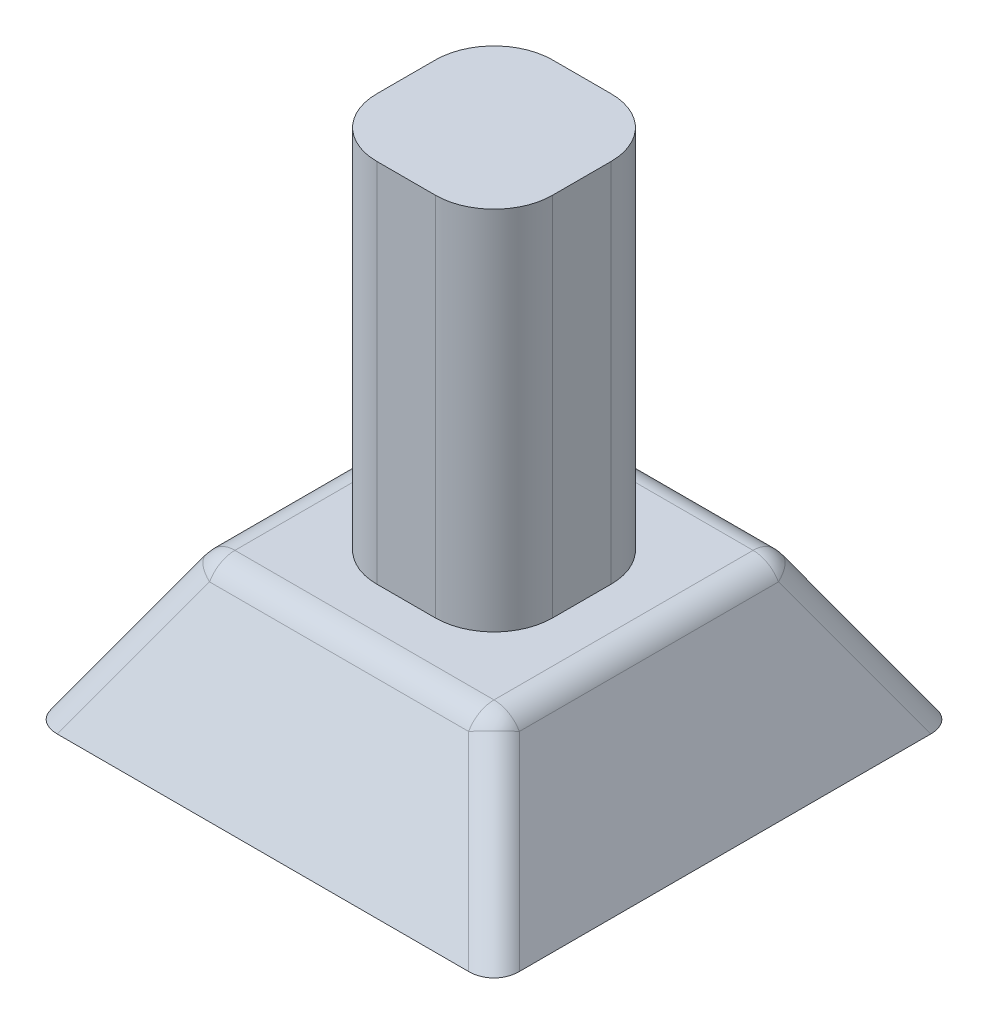
ISO-10303-21;
HEADER;
FILE_DESCRIPTION(('STEP AP214'),'2;1');
FILE_NAME('part.step','',(''),(''),'','','');
FILE_SCHEMA(('AUTOMOTIVE_DESIGN { 1 0 10303 214 1 1 1 1 }'));
ENDSEC;
DATA;
#1=APPLICATION_CONTEXT('core data for automotive mechanical design processes');
#2=APPLICATION_PROTOCOL_DEFINITION('international standard','automotive_design',2000,#1);
#3=PRODUCT_CONTEXT('',#1,'mechanical');
#4=PRODUCT('Part','Part','',(#3));
#5=PRODUCT_RELATED_PRODUCT_CATEGORY('part','',(#4));
#6=PRODUCT_DEFINITION_FORMATION('','',#4);
#7=PRODUCT_DEFINITION_CONTEXT('part definition',#1,'design');
#8=PRODUCT_DEFINITION('design','',#6,#7);
#9=PRODUCT_DEFINITION_SHAPE('','',#8);
#10=(LENGTH_UNIT() NAMED_UNIT(*) SI_UNIT(.MILLI.,.METRE.));
#11=(NAMED_UNIT(*) PLANE_ANGLE_UNIT() SI_UNIT($,.RADIAN.));
#12=(NAMED_UNIT(*) SI_UNIT($,.STERADIAN.) SOLID_ANGLE_UNIT());
#13=UNCERTAINTY_MEASURE_WITH_UNIT(LENGTH_MEASURE(1.E-05),#10,'distance_accuracy_value','');
#14=(GEOMETRIC_REPRESENTATION_CONTEXT(3) GLOBAL_UNCERTAINTY_ASSIGNED_CONTEXT((#13)) GLOBAL_UNIT_ASSIGNED_CONTEXT((#10,
#11,#12)) REPRESENTATION_CONTEXT('',''));
#15=CARTESIAN_POINT('',(0.,0.,0.));
#16=DIRECTION('',(0.,0.,1.));
#17=DIRECTION('',(1.,0.,0.));
#18=AXIS2_PLACEMENT_3D('',#15,#16,#17);
#19=CARTESIAN_POINT('',(-7.62,31.75,7.62));
#20=DIRECTION('',(1.,0.,0.));
#21=DIRECTION('',(0.,0.,-1.));
#22=AXIS2_PLACEMENT_3D('',#19,#20,#21);
#23=PLANE('',#22);
#24=DIRECTION('',(0.,0.,1.));
#25=VECTOR('',#24,1.);
#26=CARTESIAN_POINT('',(-7.62,31.75,7.62));
#27=LINE('',#26,#25);
#28=CARTESIAN_POINT('',(-7.62,31.75,-2.53999999999999));
#29=VERTEX_POINT('',#28);
#30=CARTESIAN_POINT('',(-7.62,31.75,2.54));
#31=VERTEX_POINT('',#30);
#32=EDGE_CURVE('E239',#29,#31,#27,.T.);
#33=ORIENTED_EDGE('',*,*,#32,.F.);
#34=DIRECTION('',(0.,-1.,0.));
#35=VECTOR('',#34,1.);
#36=CARTESIAN_POINT('',(-7.62,31.75,-2.54));
#37=LINE('',#36,#35);
#38=CARTESIAN_POINT('',(-7.62,0.,-2.53999999999999));
#39=VERTEX_POINT('',#38);
#40=EDGE_CURVE('E261',#29,#39,#37,.T.);
#41=ORIENTED_EDGE('',*,*,#40,.T.);
#42=DIRECTION('',(0.,0.,1.));
#43=VECTOR('',#42,1.);
#44=CARTESIAN_POINT('',(-7.62,0.,7.62));
#45=LINE('',#44,#43);
#46=CARTESIAN_POINT('',(-7.62,0.,2.54));
#47=VERTEX_POINT('',#46);
#48=EDGE_CURVE('E238',#39,#47,#45,.T.);
#49=ORIENTED_EDGE('',*,*,#48,.T.);
#50=DIRECTION('',(0.,-1.,0.));
#51=VECTOR('',#50,1.);
#52=CARTESIAN_POINT('',(-7.62,31.75,2.54));
#53=LINE('',#52,#51);
#54=EDGE_CURVE('E252',#47,#31,#53,.F.);
#55=ORIENTED_EDGE('',*,*,#54,.T.);
#56=EDGE_LOOP('',(#33,#41,#49,#55));
#57=FACE_BOUND('',#56,.T.);
#58=ADVANCED_FACE('F33',(#57),#23,.F.);
#59=CARTESIAN_POINT('',(7.62,31.75,7.62));
#60=DIRECTION('',(0.,0.,-1.));
#61=DIRECTION('',(-1.,0.,0.));
#62=AXIS2_PLACEMENT_3D('',#59,#60,#61);
#63=PLANE('',#62);
#64=DIRECTION('',(1.,0.,0.));
#65=VECTOR('',#64,1.);
#66=CARTESIAN_POINT('',(7.62,31.75,7.62));
#67=LINE('',#66,#65);
#68=CARTESIAN_POINT('',(-2.53999999999999,31.75,7.62));
#69=VERTEX_POINT('',#68);
#70=CARTESIAN_POINT('',(2.54,31.75,7.62));
#71=VERTEX_POINT('',#70);
#72=EDGE_CURVE('E242',#69,#71,#67,.T.);
#73=ORIENTED_EDGE('',*,*,#72,.F.);
#74=DIRECTION('',(0.,-1.,0.));
#75=VECTOR('',#74,1.);
#76=CARTESIAN_POINT('',(-2.54,31.75,7.62));
#77=LINE('',#76,#75);
#78=CARTESIAN_POINT('',(-2.53999999999999,0.,7.62));
#79=VERTEX_POINT('',#78);
#80=EDGE_CURVE('E291',#69,#79,#77,.T.);
#81=ORIENTED_EDGE('',*,*,#80,.T.);
#82=DIRECTION('',(1.,0.,0.));
#83=VECTOR('',#82,1.);
#84=CARTESIAN_POINT('',(7.62,0.,7.62));
#85=LINE('',#84,#83);
#86=CARTESIAN_POINT('',(2.54,0.,7.62));
#87=VERTEX_POINT('',#86);
#88=EDGE_CURVE('E255',#79,#87,#85,.T.);
#89=ORIENTED_EDGE('',*,*,#88,.T.);
#90=DIRECTION('',(0.,-1.,0.));
#91=VECTOR('',#90,1.);
#92=CARTESIAN_POINT('',(2.54,31.75,7.62));
#93=LINE('',#92,#91);
#94=EDGE_CURVE('E289',#87,#71,#93,.F.);
#95=ORIENTED_EDGE('',*,*,#94,.T.);
#96=EDGE_LOOP('',(#73,#81,#89,#95));
#97=FACE_BOUND('',#96,.T.);
#98=ADVANCED_FACE('F388',(#97),#63,.F.);
#99=CARTESIAN_POINT('',(7.62,31.75,7.62));
#100=DIRECTION('',(-1.,0.,0.));
#101=DIRECTION('',(0.,0.,1.));
#102=AXIS2_PLACEMENT_3D('',#99,#100,#101);
#103=PLANE('',#102);
#104=DIRECTION('',(0.,0.,-1.));
#105=VECTOR('',#104,1.);
#106=CARTESIAN_POINT('',(7.62,31.75,7.62));
#107=LINE('',#106,#105);
#108=CARTESIAN_POINT('',(7.62,31.75,2.54));
#109=VERTEX_POINT('',#108);
#110=CARTESIAN_POINT('',(7.62,31.75,-2.54));
#111=VERTEX_POINT('',#110);
#112=EDGE_CURVE('E246',#109,#111,#107,.T.);
#113=ORIENTED_EDGE('',*,*,#112,.F.);
#114=DIRECTION('',(0.,-1.,0.));
#115=VECTOR('',#114,1.);
#116=CARTESIAN_POINT('',(7.62,31.75,2.54));
#117=LINE('',#116,#115);
#118=CARTESIAN_POINT('',(7.62,0.,2.54));
#119=VERTEX_POINT('',#118);
#120=EDGE_CURVE('E296',#109,#119,#117,.T.);
#121=ORIENTED_EDGE('',*,*,#120,.T.);
#122=DIRECTION('',(0.,0.,-1.));
#123=VECTOR('',#122,1.);
#124=CARTESIAN_POINT('',(7.62,0.,7.62));
#125=LINE('',#124,#123);
#126=CARTESIAN_POINT('',(7.62,0.,-2.54));
#127=VERTEX_POINT('',#126);
#128=EDGE_CURVE('E257',#119,#127,#125,.T.);
#129=ORIENTED_EDGE('',*,*,#128,.T.);
#130=DIRECTION('',(0.,-1.,0.));
#131=VECTOR('',#130,1.);
#132=CARTESIAN_POINT('',(7.62,31.75,-2.54));
#133=LINE('',#132,#131);
#134=EDGE_CURVE('E294',#127,#111,#133,.F.);
#135=ORIENTED_EDGE('',*,*,#134,.T.);
#136=EDGE_LOOP('',(#113,#121,#129,#135));
#137=FACE_BOUND('',#136,.T.);
#138=ADVANCED_FACE('F394',(#137),#103,.F.);
#139=CARTESIAN_POINT('',(7.62,31.75,-7.62));
#140=DIRECTION('',(0.,0.,1.));
#141=DIRECTION('',(1.,0.,0.));
#142=AXIS2_PLACEMENT_3D('',#139,#140,#141);
#143=PLANE('',#142);
#144=DIRECTION('',(-1.,0.,0.));
#145=VECTOR('',#144,1.);
#146=CARTESIAN_POINT('',(7.62,0.,-7.62));
#147=LINE('',#146,#145);
#148=CARTESIAN_POINT('',(2.54,0.,-7.62));
#149=VERTEX_POINT('',#148);
#150=CARTESIAN_POINT('',(-2.54,0.,-7.62));
#151=VERTEX_POINT('',#150);
#152=EDGE_CURVE('E243',#149,#151,#147,.T.);
#153=ORIENTED_EDGE('',*,*,#152,.T.);
#154=DIRECTION('',(0.,-1.,0.));
#155=VECTOR('',#154,1.);
#156=CARTESIAN_POINT('',(-2.54,31.75,-7.62));
#157=LINE('',#156,#155);
#158=CARTESIAN_POINT('',(-2.54,31.75,-7.62));
#159=VERTEX_POINT('',#158);
#160=EDGE_CURVE('E279',#151,#159,#157,.F.);
#161=ORIENTED_EDGE('',*,*,#160,.T.);
#162=DIRECTION('',(-1.,0.,0.));
#163=VECTOR('',#162,1.);
#164=CARTESIAN_POINT('',(7.62,31.75,-7.62));
#165=LINE('',#164,#163);
#166=CARTESIAN_POINT('',(2.54,31.75,-7.62));
#167=VERTEX_POINT('',#166);
#168=EDGE_CURVE('E249',#167,#159,#165,.T.);
#169=ORIENTED_EDGE('',*,*,#168,.F.);
#170=DIRECTION('',(0.,-1.,0.));
#171=VECTOR('',#170,1.);
#172=CARTESIAN_POINT('',(2.54,31.75,-7.62));
#173=LINE('',#172,#171);
#174=EDGE_CURVE('E276',#167,#149,#173,.T.);
#175=ORIENTED_EDGE('',*,*,#174,.T.);
#176=EDGE_LOOP('',(#153,#161,#169,#175));
#177=FACE_BOUND('',#176,.T.);
#178=ADVANCED_FACE('F510',(#177),#143,.F.);
#179=CARTESIAN_POINT('',(0.,31.75,0.));
#180=DIRECTION('',(0.,1.,0.));
#181=DIRECTION('',(0.,0.,1.));
#182=AXIS2_PLACEMENT_3D('',#179,#180,#181);
#183=PLANE('',#182);
#184=ORIENTED_EDGE('',*,*,#168,.T.);
#185=CARTESIAN_POINT('',(-2.54,31.75,-2.54));
#186=DIRECTION('',(0.,1.,0.));
#187=DIRECTION('',(0.,0.,1.));
#188=AXIS2_PLACEMENT_3D('',#185,#186,#187);
#189=CIRCLE('',#188,5.08);
#190=EDGE_CURVE('E287',#159,#29,#189,.T.);
#191=ORIENTED_EDGE('',*,*,#190,.T.);
#192=ORIENTED_EDGE('',*,*,#32,.T.);
#193=CARTESIAN_POINT('',(-2.54,31.75,2.54));
#194=DIRECTION('',(0.,1.,0.));
#195=DIRECTION('',(0.,0.,1.));
#196=AXIS2_PLACEMENT_3D('',#193,#194,#195);
#197=CIRCLE('',#196,5.08);
#198=EDGE_CURVE('E285',#31,#69,#197,.T.);
#199=ORIENTED_EDGE('',*,*,#198,.T.);
#200=ORIENTED_EDGE('',*,*,#72,.T.);
#201=CARTESIAN_POINT('',(2.54,31.75,2.54));
#202=DIRECTION('',(0.,1.,0.));
#203=DIRECTION('',(0.,0.,1.));
#204=AXIS2_PLACEMENT_3D('',#201,#202,#203);
#205=CIRCLE('',#204,5.08);
#206=EDGE_CURVE('E283',#71,#109,#205,.T.);
#207=ORIENTED_EDGE('',*,*,#206,.T.);
#208=ORIENTED_EDGE('',*,*,#112,.T.);
#209=CARTESIAN_POINT('',(2.54,31.75,-2.54));
#210=DIRECTION('',(0.,1.,0.));
#211=DIRECTION('',(0.,0.,1.));
#212=AXIS2_PLACEMENT_3D('',#209,#210,#211);
#213=CIRCLE('',#212,5.08);
#214=EDGE_CURVE('E281',#111,#167,#213,.T.);
#215=ORIENTED_EDGE('',*,*,#214,.T.);
#216=EDGE_LOOP('',(#184,#191,#192,#199,#200,#207,#208,#215));
#217=FACE_BOUND('',#216,.T.);
#218=ADVANCED_FACE('F404',(#217),#183,.T.);
#219=CARTESIAN_POINT('',(-2.54,31.75,-2.54));
#220=DIRECTION('',(0.,-1.,0.));
#221=DIRECTION('',(0.,0.,-1.));
#222=AXIS2_PLACEMENT_3D('',#219,#220,#221);
#223=CYLINDRICAL_SURFACE('',#222,5.08);
#224=ORIENTED_EDGE('',*,*,#190,.F.);
#225=ORIENTED_EDGE('',*,*,#160,.F.);
#226=CARTESIAN_POINT('',(-2.54,0.,-2.54));
#227=DIRECTION('',(0.,1.,0.));
#228=DIRECTION('',(0.,0.,1.));
#229=AXIS2_PLACEMENT_3D('',#226,#227,#228);
#230=CIRCLE('',#229,5.08);
#231=EDGE_CURVE('E273',#39,#151,#230,.F.);
#232=ORIENTED_EDGE('',*,*,#231,.F.);
#233=ORIENTED_EDGE('',*,*,#40,.F.);
#234=EDGE_LOOP('',(#224,#225,#232,#233));
#235=FACE_BOUND('',#234,.T.);
#236=ADVANCED_FACE('F400',(#235),#223,.T.);
#237=CARTESIAN_POINT('',(-2.54,31.75,2.54));
#238=DIRECTION('',(0.,-1.,0.));
#239=DIRECTION('',(0.,0.,-1.));
#240=AXIS2_PLACEMENT_3D('',#237,#238,#239);
#241=CYLINDRICAL_SURFACE('',#240,5.08);
#242=ORIENTED_EDGE('',*,*,#198,.F.);
#243=ORIENTED_EDGE('',*,*,#54,.F.);
#244=CARTESIAN_POINT('',(-2.54,0.,2.54));
#245=DIRECTION('',(0.,1.,0.));
#246=DIRECTION('',(0.,0.,1.));
#247=AXIS2_PLACEMENT_3D('',#244,#245,#246);
#248=CIRCLE('',#247,5.08);
#249=EDGE_CURVE('E270',#79,#47,#248,.F.);
#250=ORIENTED_EDGE('',*,*,#249,.F.);
#251=ORIENTED_EDGE('',*,*,#80,.F.);
#252=EDGE_LOOP('',(#242,#243,#250,#251));
#253=FACE_BOUND('',#252,.T.);
#254=ADVANCED_FACE('F403',(#253),#241,.T.);
#255=CARTESIAN_POINT('',(2.54,31.75,2.54));
#256=DIRECTION('',(0.,-1.,0.));
#257=DIRECTION('',(0.,0.,-1.));
#258=AXIS2_PLACEMENT_3D('',#255,#256,#257);
#259=CYLINDRICAL_SURFACE('',#258,5.08);
#260=ORIENTED_EDGE('',*,*,#206,.F.);
#261=ORIENTED_EDGE('',*,*,#94,.F.);
#262=CARTESIAN_POINT('',(2.54,0.,2.54));
#263=DIRECTION('',(0.,1.,0.));
#264=DIRECTION('',(0.,0.,1.));
#265=AXIS2_PLACEMENT_3D('',#262,#263,#264);
#266=CIRCLE('',#265,5.08);
#267=EDGE_CURVE('E267',#119,#87,#266,.F.);
#268=ORIENTED_EDGE('',*,*,#267,.F.);
#269=ORIENTED_EDGE('',*,*,#120,.F.);
#270=EDGE_LOOP('',(#260,#261,#268,#269));
#271=FACE_BOUND('',#270,.T.);
#272=ADVANCED_FACE('F408',(#271),#259,.T.);
#273=CARTESIAN_POINT('',(2.54,31.75,-2.54));
#274=DIRECTION('',(0.,-1.,0.));
#275=DIRECTION('',(0.,0.,-1.));
#276=AXIS2_PLACEMENT_3D('',#273,#274,#275);
#277=CYLINDRICAL_SURFACE('',#276,5.08);
#278=ORIENTED_EDGE('',*,*,#214,.F.);
#279=ORIENTED_EDGE('',*,*,#134,.F.);
#280=CARTESIAN_POINT('',(2.54,0.,-2.54));
#281=DIRECTION('',(0.,1.,0.));
#282=DIRECTION('',(0.,0.,1.));
#283=AXIS2_PLACEMENT_3D('',#280,#281,#282);
#284=CIRCLE('',#283,5.08);
#285=EDGE_CURVE('E264',#149,#127,#284,.F.);
#286=ORIENTED_EDGE('',*,*,#285,.F.);
#287=ORIENTED_EDGE('',*,*,#174,.F.);
#288=EDGE_LOOP('',(#278,#279,#286,#287));
#289=FACE_BOUND('',#288,.T.);
#290=ADVANCED_FACE('F412',(#289),#277,.T.);
#291=CARTESIAN_POINT('',(0.,0.,0.));
#292=DIRECTION('',(0.,-1.,0.));
#293=DIRECTION('',(0.,0.,-1.));
#294=AXIS2_PLACEMENT_3D('',#291,#292,#293);
#295=PLANE('',#294);
#296=DIRECTION('',(-1.,0.,0.));
#297=VECTOR('',#296,1.);
#298=CARTESIAN_POINT('',(0.,0.,-11.2335303162584));
#299=LINE('',#298,#297);
#300=CARTESIAN_POINT('',(11.2335303162584,0.,-11.2335303162583));
#301=VERTEX_POINT('',#300);
#302=CARTESIAN_POINT('',(-11.2335303162584,0.,-11.2335303162584));
#303=VERTEX_POINT('',#302);
#304=EDGE_CURVE('E310',#301,#303,#299,.T.);
#305=ORIENTED_EDGE('',*,*,#304,.T.);
#306=DIRECTION('',(0.,0.,1.));
#307=VECTOR('',#306,1.);
#308=CARTESIAN_POINT('',(-11.2335303162584,0.,0.));
#309=LINE('',#308,#307);
#310=CARTESIAN_POINT('',(-11.2335303162584,0.,11.2335303162583));
#311=VERTEX_POINT('',#310);
#312=EDGE_CURVE('E312',#303,#311,#309,.T.);
#313=ORIENTED_EDGE('',*,*,#312,.T.);
#314=DIRECTION('',(1.,0.,0.));
#315=VECTOR('',#314,1.);
#316=CARTESIAN_POINT('',(0.,0.,11.2335303162583));
#317=LINE('',#316,#315);
#318=CARTESIAN_POINT('',(11.2335303162584,0.,11.2335303162584));
#319=VERTEX_POINT('',#318);
#320=EDGE_CURVE('E306',#311,#319,#317,.T.);
#321=ORIENTED_EDGE('',*,*,#320,.T.);
#322=DIRECTION('',(0.,0.,-1.));
#323=VECTOR('',#322,1.);
#324=CARTESIAN_POINT('',(11.2335303162584,0.,0.));
#325=LINE('',#324,#323);
#326=EDGE_CURVE('E308',#319,#301,#325,.T.);
#327=ORIENTED_EDGE('',*,*,#326,.T.);
#328=EDGE_LOOP('',(#305,#313,#321,#327));
#329=FACE_BOUND('',#328,.T.);
#330=ORIENTED_EDGE('',*,*,#48,.F.);
#331=ORIENTED_EDGE('',*,*,#231,.T.);
#332=ORIENTED_EDGE('',*,*,#152,.F.);
#333=ORIENTED_EDGE('',*,*,#285,.T.);
#334=ORIENTED_EDGE('',*,*,#128,.F.);
#335=ORIENTED_EDGE('',*,*,#267,.T.);
#336=ORIENTED_EDGE('',*,*,#88,.F.);
#337=ORIENTED_EDGE('',*,*,#249,.T.);
#338=EDGE_LOOP('',(#330,#331,#332,#333,#334,#335,#336,#337));
#339=FACE_BOUND('',#338,.T.);
#340=ADVANCED_FACE('F416',(#329,#339),#295,.F.);
#341=CARTESIAN_POINT('',(-12.7,0.,-12.7));
#342=DIRECTION('',(-0.866025403784438,0.500000000000001,0.));
#343=DIRECTION('',(-0.500000000000001,-0.866025403784438,0.));
#344=AXIS2_PLACEMENT_3D('',#341,#342,#343);
#345=PLANE('',#344);
#346=DIRECTION('',(0.,0.,-1.));
#347=VECTOR('',#346,1.);
#348=CARTESIAN_POINT('',(-13.4332348418708,-1.27,-12.7));
#349=LINE('',#348,#347);
#350=CARTESIAN_POINT('',(-13.4332348418708,-1.27,11.2335303162584));
#351=VERTEX_POINT('',#350);
#352=CARTESIAN_POINT('',(-13.4332348418708,-1.27,-11.2335303162584));
#353=VERTEX_POINT('',#352);
#354=EDGE_CURVE('E301',#351,#353,#349,.T.);
#355=ORIENTED_EDGE('',*,*,#354,.T.);
#356=DIRECTION('',(-0.447213595499959,-0.774596669241483,-0.447213595499959));
#357=VECTOR('',#356,1.);
#358=CARTESIAN_POINT('',(-13.1399409051225,-0.762,-10.94023637951));
#359=LINE('',#358,#357);
#360=CARTESIAN_POINT('',(-20.0323484187083,-12.7,-17.8326438930958));
#361=VERTEX_POINT('',#360);
#362=EDGE_CURVE('E304',#353,#361,#359,.T.);
#363=ORIENTED_EDGE('',*,*,#362,.T.);
#364=DIRECTION('',(0.,0.,1.));
#365=VECTOR('',#364,1.);
#366=CARTESIAN_POINT('',(-20.0323484187083,-12.7,-12.7));
#367=LINE('',#366,#365);
#368=CARTESIAN_POINT('',(-20.0323484187083,-12.7,17.8326438930958));
#369=VERTEX_POINT('',#368);
#370=EDGE_CURVE('E216',#369,#361,#367,.F.);
#371=ORIENTED_EDGE('',*,*,#370,.F.);
#372=DIRECTION('',(-0.447213595499959,-0.774596669241483,0.447213595499959));
#373=VECTOR('',#372,1.);
#374=CARTESIAN_POINT('',(-8.05994090512248,8.0368181024499,5.86023637951001));
#375=LINE('',#374,#373);
#376=EDGE_CURVE('E299',#369,#351,#375,.F.);
#377=ORIENTED_EDGE('',*,*,#376,.T.);
#378=EDGE_LOOP('',(#355,#363,#371,#377));
#379=FACE_BOUND('',#378,.T.);
#380=ADVANCED_FACE('F490',(#379),#345,.T.);
#381=CARTESIAN_POINT('',(12.7,0.,-12.7));
#382=DIRECTION('',(0.,0.500000000000001,-0.866025403784438));
#383=DIRECTION('',(0.,0.866025403784438,0.500000000000001));
#384=AXIS2_PLACEMENT_3D('',#381,#382,#383);
#385=PLANE('',#384);
#386=DIRECTION('',(-1.,0.,0.));
#387=VECTOR('',#386,1.);
#388=CARTESIAN_POINT('',(12.7,-12.7,-20.0323484187083));
#389=LINE('',#388,#387);
#390=CARTESIAN_POINT('',(-17.8326438930958,-12.7,-20.0323484187083));
#391=VERTEX_POINT('',#390);
#392=CARTESIAN_POINT('',(17.8326438930958,-12.7,-20.0323484187083));
#393=VERTEX_POINT('',#392);
#394=EDGE_CURVE('E229',#391,#393,#389,.F.);
#395=ORIENTED_EDGE('',*,*,#394,.F.);
#396=DIRECTION('',(-0.447213595499959,-0.774596669241482,-0.447213595499959));
#397=VECTOR('',#396,1.);
#398=CARTESIAN_POINT('',(-5.86023637951,8.0368181024499,-8.05994090512248));
#399=LINE('',#398,#397);
#400=CARTESIAN_POINT('',(-11.2335303162584,-1.27,-13.4332348418708));
#401=VERTEX_POINT('',#400);
#402=EDGE_CURVE('E319',#391,#401,#399,.F.);
#403=ORIENTED_EDGE('',*,*,#402,.T.);
#404=DIRECTION('',(1.,0.,0.));
#405=VECTOR('',#404,1.);
#406=CARTESIAN_POINT('',(12.7,-1.27,-13.4332348418708));
#407=LINE('',#406,#405);
#408=CARTESIAN_POINT('',(11.2335303162584,-1.27,-13.4332348418708));
#409=VERTEX_POINT('',#408);
#410=EDGE_CURVE('E317',#401,#409,#407,.T.);
#411=ORIENTED_EDGE('',*,*,#410,.T.);
#412=DIRECTION('',(0.447213595499959,-0.774596669241483,-0.447213595499959));
#413=VECTOR('',#412,1.);
#414=CARTESIAN_POINT('',(10.94023637951,-0.761999999999999,-13.1399409051225));
#415=LINE('',#414,#413);
#416=EDGE_CURVE('E315',#409,#393,#415,.T.);
#417=ORIENTED_EDGE('',*,*,#416,.T.);
#418=EDGE_LOOP('',(#395,#403,#411,#417));
#419=FACE_BOUND('',#418,.T.);
#420=ADVANCED_FACE('F495',(#419),#385,.T.);
#421=CARTESIAN_POINT('',(12.7,0.,-12.7));
#422=DIRECTION('',(0.866025403784438,0.500000000000001,0.));
#423=DIRECTION('',(-0.500000000000001,0.866025403784438,0.));
#424=AXIS2_PLACEMENT_3D('',#421,#422,#423);
#425=PLANE('',#424);
#426=DIRECTION('',(0.,0.,-1.));
#427=VECTOR('',#426,1.);
#428=CARTESIAN_POINT('',(20.0323484187083,-12.7,-12.7));
#429=LINE('',#428,#427);
#430=CARTESIAN_POINT('',(20.0323484187083,-12.7,-17.8326438930958));
#431=VERTEX_POINT('',#430);
#432=CARTESIAN_POINT('',(20.0323484187083,-12.7,17.8326438930958));
#433=VERTEX_POINT('',#432);
#434=EDGE_CURVE('E232',#431,#433,#429,.F.);
#435=ORIENTED_EDGE('',*,*,#434,.F.);
#436=DIRECTION('',(0.447213595499959,-0.774596669241483,-0.447213595499959));
#437=VECTOR('',#436,1.);
#438=CARTESIAN_POINT('',(13.1399409051225,-0.761999999999999,-10.94023637951));
#439=LINE('',#438,#437);
#440=CARTESIAN_POINT('',(13.4332348418708,-1.27,-11.2335303162583));
#441=VERTEX_POINT('',#440);
#442=EDGE_CURVE('E325',#431,#441,#439,.F.);
#443=ORIENTED_EDGE('',*,*,#442,.T.);
#444=DIRECTION('',(0.,0.,1.));
#445=VECTOR('',#444,1.);
#446=CARTESIAN_POINT('',(13.4332348418708,-1.27,-12.7));
#447=LINE('',#446,#445);
#448=CARTESIAN_POINT('',(13.4332348418708,-1.27,11.2335303162584));
#449=VERTEX_POINT('',#448);
#450=EDGE_CURVE('E323',#441,#449,#447,.T.);
#451=ORIENTED_EDGE('',*,*,#450,.T.);
#452=DIRECTION('',(0.447213595499959,-0.774596669241483,0.447213595499959));
#453=VECTOR('',#452,1.);
#454=CARTESIAN_POINT('',(8.05994090512248,8.0368181024499,5.86023637951001));
#455=LINE('',#454,#453);
#456=EDGE_CURVE('E321',#449,#433,#455,.T.);
#457=ORIENTED_EDGE('',*,*,#456,.T.);
#458=EDGE_LOOP('',(#435,#443,#451,#457));
#459=FACE_BOUND('',#458,.T.);
#460=ADVANCED_FACE('F468',(#459),#425,.T.);
#461=CARTESIAN_POINT('',(12.7,0.,12.7));
#462=DIRECTION('',(0.,0.500000000000001,0.866025403784438));
#463=DIRECTION('',(0.,-0.866025403784438,0.500000000000001));
#464=AXIS2_PLACEMENT_3D('',#461,#462,#463);
#465=PLANE('',#464);
#466=DIRECTION('',(1.,0.,0.));
#467=VECTOR('',#466,1.);
#468=CARTESIAN_POINT('',(12.7,-12.7,20.0323484187083));
#469=LINE('',#468,#467);
#470=CARTESIAN_POINT('',(17.8326438930958,-12.7,20.0323484187083));
#471=VERTEX_POINT('',#470);
#472=CARTESIAN_POINT('',(-17.8326438930958,-12.7,20.0323484187083));
#473=VERTEX_POINT('',#472);
#474=EDGE_CURVE('E235',#471,#473,#469,.F.);
#475=ORIENTED_EDGE('',*,*,#474,.F.);
#476=DIRECTION('',(0.447213595499959,-0.774596669241483,0.447213595499959));
#477=VECTOR('',#476,1.);
#478=CARTESIAN_POINT('',(10.94023637951,-0.762,13.1399409051225));
#479=LINE('',#478,#477);
#480=CARTESIAN_POINT('',(11.2335303162584,-1.27,13.4332348418708));
#481=VERTEX_POINT('',#480);
#482=EDGE_CURVE('E50',#471,#481,#479,.F.);
#483=ORIENTED_EDGE('',*,*,#482,.T.);
#484=DIRECTION('',(-1.,0.,0.));
#485=VECTOR('',#484,1.);
#486=CARTESIAN_POINT('',(12.7,-1.27,13.4332348418708));
#487=LINE('',#486,#485);
#488=CARTESIAN_POINT('',(-11.2335303162584,-1.27,13.4332348418708));
#489=VERTEX_POINT('',#488);
#490=EDGE_CURVE('E55',#481,#489,#487,.T.);
#491=ORIENTED_EDGE('',*,*,#490,.T.);
#492=DIRECTION('',(-0.447213595499959,-0.774596669241483,0.447213595499959));
#493=VECTOR('',#492,1.);
#494=CARTESIAN_POINT('',(-5.86023637951,8.0368181024499,8.05994090512248));
#495=LINE('',#494,#493);
#496=EDGE_CURVE('E327',#489,#473,#495,.T.);
#497=ORIENTED_EDGE('',*,*,#496,.T.);
#498=EDGE_LOOP('',(#475,#483,#491,#497));
#499=FACE_BOUND('',#498,.T.);
#500=ADVANCED_FACE('F486',(#499),#465,.T.);
#501=CARTESIAN_POINT('',(0.,-12.7,0.));
#502=DIRECTION('',(0.,-1.,0.));
#503=DIRECTION('',(0.,0.,-1.));
#504=AXIS2_PLACEMENT_3D('',#501,#502,#503);
#505=PLANE('',#504);
#506=DIRECTION('',(-1.,0.,0.));
#507=VECTOR('',#506,1.);
#508=CARTESIAN_POINT('',(14.9523484187083,-12.7,14.9523484187083));
#509=LINE('',#508,#507);
#510=CARTESIAN_POINT('',(14.9523484187083,-12.7,14.9523484187083));
#511=VERTEX_POINT('',#510);
#512=CARTESIAN_POINT('',(-14.9523484187083,-12.7,14.9523484187083));
#513=VERTEX_POINT('',#512);
#514=EDGE_CURVE('E203',#511,#513,#509,.T.);
#515=ORIENTED_EDGE('',*,*,#514,.F.);
#516=DIRECTION('',(0.,0.,1.));
#517=VECTOR('',#516,1.);
#518=CARTESIAN_POINT('',(14.9523484187083,-12.7,-14.9523484187083));
#519=LINE('',#518,#517);
#520=CARTESIAN_POINT('',(14.9523484187083,-12.7,-14.9523484187083));
#521=VERTEX_POINT('',#520);
#522=EDGE_CURVE('E208',#521,#511,#519,.T.);
#523=ORIENTED_EDGE('',*,*,#522,.F.);
#524=DIRECTION('',(1.,0.,0.));
#525=VECTOR('',#524,1.);
#526=CARTESIAN_POINT('',(-14.9523484187083,-12.7,-14.9523484187083));
#527=LINE('',#526,#525);
#528=CARTESIAN_POINT('',(-14.9523484187083,-12.7,-14.9523484187083));
#529=VERTEX_POINT('',#528);
#530=EDGE_CURVE('E187',#529,#521,#527,.T.);
#531=ORIENTED_EDGE('',*,*,#530,.F.);
#532=DIRECTION('',(0.,0.,-1.));
#533=VECTOR('',#532,1.);
#534=CARTESIAN_POINT('',(-14.9523484187083,-12.7,14.9523484187083));
#535=LINE('',#534,#533);
#536=EDGE_CURVE('E199',#513,#529,#535,.T.);
#537=ORIENTED_EDGE('',*,*,#536,.F.);
#538=EDGE_LOOP('',(#515,#523,#531,#537));
#539=FACE_BOUND('',#538,.T.);
#540=ORIENTED_EDGE('',*,*,#370,.T.);
#541=CARTESIAN_POINT('',(-17.099409051225,-12.7,-17.099409051225));
#542=DIRECTION('',(0.,-1.,0.));
#543=DIRECTION('',(0.707106781186547,0.,0.707106781186548));
#544=AXIS2_PLACEMENT_3D('',#541,#542,#543);
#545=ELLIPSE('',#544,3.27912589978895,2.54);
#546=EDGE_CURVE('E11',#361,#391,#545,.T.);
#547=ORIENTED_EDGE('',*,*,#546,.T.);
#548=ORIENTED_EDGE('',*,*,#394,.T.);
#549=CARTESIAN_POINT('',(17.099409051225,-12.7,-17.099409051225));
#550=DIRECTION('',(0.,-1.,0.));
#551=DIRECTION('',(-0.707106781186548,0.,0.707106781186547));
#552=AXIS2_PLACEMENT_3D('',#549,#550,#551);
#553=ELLIPSE('',#552,3.27912589978895,2.54);
#554=EDGE_CURVE('E42',#393,#431,#553,.T.);
#555=ORIENTED_EDGE('',*,*,#554,.T.);
#556=ORIENTED_EDGE('',*,*,#434,.T.);
#557=CARTESIAN_POINT('',(17.099409051225,-12.7,17.099409051225));
#558=DIRECTION('',(0.,-1.,0.));
#559=DIRECTION('',(-0.707106781186548,0.,-0.707106781186548));
#560=AXIS2_PLACEMENT_3D('',#557,#558,#559);
#561=ELLIPSE('',#560,3.27912589978895,2.54);
#562=EDGE_CURVE('E333',#433,#471,#561,.T.);
#563=ORIENTED_EDGE('',*,*,#562,.T.);
#564=ORIENTED_EDGE('',*,*,#474,.T.);
#565=CARTESIAN_POINT('',(-17.099409051225,-12.7,17.099409051225));
#566=DIRECTION('',(0.,-1.,0.));
#567=DIRECTION('',(0.707106781186548,0.,-0.707106781186548));
#568=AXIS2_PLACEMENT_3D('',#565,#566,#567);
#569=ELLIPSE('',#568,3.27912589978895,2.54);
#570=EDGE_CURVE('E331',#473,#369,#569,.T.);
#571=ORIENTED_EDGE('',*,*,#570,.T.);
#572=EDGE_LOOP('',(#540,#547,#548,#555,#556,#563,#564,#571));
#573=FACE_BOUND('',#572,.T.);
#574=ADVANCED_FACE('F205',(#539,#573),#505,.T.);
#575=CARTESIAN_POINT('',(14.9523484187083,-12.7,14.9523484187083));
#576=DIRECTION('',(0.,0.500000000000001,0.866025403784438));
#577=DIRECTION('',(0.,-0.866025403784438,0.500000000000001));
#578=AXIS2_PLACEMENT_3D('',#575,#576,#577);
#579=PLANE('',#578);
#580=ORIENTED_EDGE('',*,*,#514,.T.);
#581=DIRECTION('',(-0.447213595499959,-0.774596669241483,0.447213595499959));
#582=VECTOR('',#581,1.);
#583=CARTESIAN_POINT('',(-8.97140905122494,-2.34070913853004,8.97140905122493));
#584=LINE('',#583,#582);
#585=CARTESIAN_POINT('',(-9.08646968374165,-2.54,9.08646968374165));
#586=VERTEX_POINT('',#585);
#587=EDGE_CURVE('E195',#586,#513,#584,.T.);
#588=ORIENTED_EDGE('',*,*,#587,.F.);
#589=DIRECTION('',(-1.,0.,0.));
#590=VECTOR('',#589,1.);
#591=CARTESIAN_POINT('',(0.,-2.54,9.08646968374165));
#592=LINE('',#591,#590);
#593=CARTESIAN_POINT('',(9.08646968374165,-2.54,9.08646968374165));
#594=VERTEX_POINT('',#593);
#595=EDGE_CURVE('E210',#594,#586,#592,.T.);
#596=ORIENTED_EDGE('',*,*,#595,.F.);
#597=DIRECTION('',(0.447213595499959,-0.774596669241483,0.447213595499959));
#598=VECTOR('',#597,1.);
#599=CARTESIAN_POINT('',(8.97140905122494,-2.34070913853004,8.97140905122494));
#600=LINE('',#599,#598);
#601=EDGE_CURVE('E214',#594,#511,#600,.T.);
#602=ORIENTED_EDGE('',*,*,#601,.T.);
#603=EDGE_LOOP('',(#580,#588,#596,#602));
#604=FACE_BOUND('',#603,.T.);
#605=ADVANCED_FACE('F370',(#604),#579,.F.);
#606=CARTESIAN_POINT('',(14.9523484187083,-12.7,-14.9523484187083));
#607=DIRECTION('',(0.866025403784438,0.500000000000001,0.));
#608=DIRECTION('',(-0.500000000000001,0.866025403784438,0.));
#609=AXIS2_PLACEMENT_3D('',#606,#607,#608);
#610=PLANE('',#609);
#611=ORIENTED_EDGE('',*,*,#522,.T.);
#612=ORIENTED_EDGE('',*,*,#601,.F.);
#613=DIRECTION('',(0.,0.,1.));
#614=VECTOR('',#613,1.);
#615=CARTESIAN_POINT('',(9.08646968374165,-2.54,0.));
#616=LINE('',#615,#614);
#617=CARTESIAN_POINT('',(9.08646968374165,-2.54,-9.08646968374165));
#618=VERTEX_POINT('',#617);
#619=EDGE_CURVE('E217',#618,#594,#616,.T.);
#620=ORIENTED_EDGE('',*,*,#619,.F.);
#621=DIRECTION('',(0.447213595499959,-0.774596669241483,-0.447213595499958));
#622=VECTOR('',#621,1.);
#623=CARTESIAN_POINT('',(8.97140905122494,-2.34070913853004,-8.97140905122494));
#624=LINE('',#623,#622);
#625=EDGE_CURVE('E194',#618,#521,#624,.T.);
#626=ORIENTED_EDGE('',*,*,#625,.T.);
#627=EDGE_LOOP('',(#611,#612,#620,#626));
#628=FACE_BOUND('',#627,.T.);
#629=ADVANCED_FACE('F374',(#628),#610,.F.);
#630=CARTESIAN_POINT('',(-14.9523484187083,-12.7,-14.9523484187083));
#631=DIRECTION('',(0.,0.500000000000001,-0.866025403784438));
#632=DIRECTION('',(0.,0.866025403784438,0.500000000000001));
#633=AXIS2_PLACEMENT_3D('',#630,#631,#632);
#634=PLANE('',#633);
#635=ORIENTED_EDGE('',*,*,#530,.T.);
#636=ORIENTED_EDGE('',*,*,#625,.F.);
#637=DIRECTION('',(1.,0.,0.));
#638=VECTOR('',#637,1.);
#639=CARTESIAN_POINT('',(0.,-2.54,-9.08646968374165));
#640=LINE('',#639,#638);
#641=CARTESIAN_POINT('',(-9.08646968374165,-2.54,-9.08646968374165));
#642=VERTEX_POINT('',#641);
#643=EDGE_CURVE('E190',#642,#618,#640,.T.);
#644=ORIENTED_EDGE('',*,*,#643,.F.);
#645=DIRECTION('',(-0.447213595499959,-0.774596669241483,-0.447213595499959));
#646=VECTOR('',#645,1.);
#647=CARTESIAN_POINT('',(-8.97140905122494,-2.34070913853004,-8.97140905122494));
#648=LINE('',#647,#646);
#649=EDGE_CURVE('E183',#642,#529,#648,.T.);
#650=ORIENTED_EDGE('',*,*,#649,.T.);
#651=EDGE_LOOP('',(#635,#636,#644,#650));
#652=FACE_BOUND('',#651,.T.);
#653=ADVANCED_FACE('F185',(#652),#634,.F.);
#654=CARTESIAN_POINT('',(-14.9523484187083,-12.7,14.9523484187083));
#655=DIRECTION('',(-0.866025403784438,0.500000000000001,0.));
#656=DIRECTION('',(-0.500000000000001,-0.866025403784438,0.));
#657=AXIS2_PLACEMENT_3D('',#654,#655,#656);
#658=PLANE('',#657);
#659=ORIENTED_EDGE('',*,*,#536,.T.);
#660=ORIENTED_EDGE('',*,*,#649,.F.);
#661=DIRECTION('',(0.,0.,-1.));
#662=VECTOR('',#661,1.);
#663=CARTESIAN_POINT('',(-9.08646968374165,-2.54,0.));
#664=LINE('',#663,#662);
#665=EDGE_CURVE('E222',#586,#642,#664,.T.);
#666=ORIENTED_EDGE('',*,*,#665,.F.);
#667=ORIENTED_EDGE('',*,*,#587,.T.);
#668=EDGE_LOOP('',(#659,#660,#666,#667));
#669=FACE_BOUND('',#668,.T.);
#670=ADVANCED_FACE('F200',(#669),#658,.F.);
#671=CARTESIAN_POINT('',(0.,-2.54,0.));
#672=DIRECTION('',(0.,-1.,0.));
#673=DIRECTION('',(0.,0.,-1.));
#674=AXIS2_PLACEMENT_3D('',#671,#672,#673);
#675=PLANE('',#674);
#676=ORIENTED_EDGE('',*,*,#595,.T.);
#677=ORIENTED_EDGE('',*,*,#665,.T.);
#678=ORIENTED_EDGE('',*,*,#643,.T.);
#679=ORIENTED_EDGE('',*,*,#619,.T.);
#680=EDGE_LOOP('',(#676,#677,#678,#679));
#681=FACE_BOUND('',#680,.T.);
#682=ADVANCED_FACE('F376',(#681),#675,.T.);
#683=CARTESIAN_POINT('',(10.94023637951,-2.032,10.94023637951));
#684=DIRECTION('',(-0.447213595499959,0.774596669241482,-0.447213595499959));
#685=DIRECTION('',(-0.866025403784438,-0.500000000000001,0.));
#686=AXIS2_PLACEMENT_3D('',#683,#684,#685);
#687=CYLINDRICAL_SURFACE('',#686,2.54);
#688=ORIENTED_EDGE('',*,*,#562,.F.);
#689=ORIENTED_EDGE('',*,*,#456,.F.);
#690=CARTESIAN_POINT('',(11.2335303162584,-2.54,11.2335303162584));
#691=DIRECTION('',(-0.447213595499959,0.774596669241482,-0.447213595499959));
#692=DIRECTION('',(-0.866025403784438,-0.500000000000001,0.));
#693=AXIS2_PLACEMENT_3D('',#690,#691,#692);
#694=CIRCLE('',#693,2.54);
#695=EDGE_CURVE('E363',#481,#449,#694,.T.);
#696=ORIENTED_EDGE('',*,*,#695,.F.);
#697=ORIENTED_EDGE('',*,*,#482,.F.);
#698=EDGE_LOOP('',(#688,#689,#696,#697));
#699=FACE_BOUND('',#698,.T.);
#700=ADVANCED_FACE('F35',(#699),#687,.T.);
#701=CARTESIAN_POINT('',(10.94023637951,-2.032,-10.94023637951));
#702=DIRECTION('',(-0.447213595499959,0.774596669241483,0.447213595499959));
#703=DIRECTION('',(-0.866025403784438,-0.500000000000001,0.));
#704=AXIS2_PLACEMENT_3D('',#701,#702,#703);
#705=CYLINDRICAL_SURFACE('',#704,2.54);
#706=ORIENTED_EDGE('',*,*,#554,.F.);
#707=ORIENTED_EDGE('',*,*,#416,.F.);
#708=CARTESIAN_POINT('',(11.2335303162584,-2.54,-11.2335303162583));
#709=DIRECTION('',(-0.447213595499959,0.774596669241483,0.447213595499958));
#710=DIRECTION('',(-0.866025403784438,-0.500000000000001,0.));
#711=AXIS2_PLACEMENT_3D('',#708,#709,#710);
#712=CIRCLE('',#711,2.54);
#713=EDGE_CURVE('E361',#441,#409,#712,.T.);
#714=ORIENTED_EDGE('',*,*,#713,.F.);
#715=ORIENTED_EDGE('',*,*,#442,.F.);
#716=EDGE_LOOP('',(#706,#707,#714,#715));
#717=FACE_BOUND('',#716,.T.);
#718=ADVANCED_FACE('F383',(#717),#705,.T.);
#719=CARTESIAN_POINT('',(11.2335303162584,-2.54,-12.7));
#720=DIRECTION('',(0.,0.,-1.));
#721=DIRECTION('',(-1.,0.,0.));
#722=AXIS2_PLACEMENT_3D('',#719,#720,#721);
#723=CYLINDRICAL_SURFACE('',#722,2.54);
#724=CARTESIAN_POINT('',(11.2335303162584,-2.54,11.2335303162584));
#725=DIRECTION('',(0.,0.,1.));
#726=DIRECTION('',(1.,0.,0.));
#727=AXIS2_PLACEMENT_3D('',#724,#725,#726);
#728=CIRCLE('',#727,2.54);
#729=EDGE_CURVE('E37',#449,#319,#728,.T.);
#730=ORIENTED_EDGE('',*,*,#729,.F.);
#731=ORIENTED_EDGE('',*,*,#450,.F.);
#732=CARTESIAN_POINT('',(11.2335303162584,-2.54,-11.2335303162583));
#733=DIRECTION('',(0.,0.,-1.));
#734=DIRECTION('',(-1.,0.,0.));
#735=AXIS2_PLACEMENT_3D('',#732,#733,#734);
#736=CIRCLE('',#735,2.54);
#737=EDGE_CURVE('E358',#301,#441,#736,.T.);
#738=ORIENTED_EDGE('',*,*,#737,.F.);
#739=ORIENTED_EDGE('',*,*,#326,.F.);
#740=EDGE_LOOP('',(#730,#731,#738,#739));
#741=FACE_BOUND('',#740,.T.);
#742=ADVANCED_FACE('F453',(#741),#723,.T.);
#743=CARTESIAN_POINT('',(11.2335303162584,-2.54,11.2335303162584));
#744=DIRECTION('',(0.,0.,1.));
#745=DIRECTION('',(1.,0.,0.));
#746=AXIS2_PLACEMENT_3D('',#743,#744,#745);
#747=SPHERICAL_SURFACE('',#746,2.54);
#748=ORIENTED_EDGE('',*,*,#695,.T.);
#749=ORIENTED_EDGE('',*,*,#729,.T.);
#750=CARTESIAN_POINT('',(11.2335303162584,-2.54,11.2335303162584));
#751=DIRECTION('',(1.,0.,0.));
#752=DIRECTION('',(0.,0.,-1.));
#753=AXIS2_PLACEMENT_3D('',#750,#751,#752);
#754=CIRCLE('',#753,2.54);
#755=EDGE_CURVE('E355',#481,#319,#754,.F.);
#756=ORIENTED_EDGE('',*,*,#755,.F.);
#757=EDGE_LOOP('',(#748,#749,#756));
#758=FACE_BOUND('',#757,.T.);
#759=ADVANCED_FACE('F449',(#758),#747,.T.);
#760=CARTESIAN_POINT('',(11.2335303162584,-2.54,-11.2335303162583));
#761=DIRECTION('',(0.,0.,1.));
#762=DIRECTION('',(1.,0.,0.));
#763=AXIS2_PLACEMENT_3D('',#760,#761,#762);
#764=SPHERICAL_SURFACE('',#763,2.54);
#765=ORIENTED_EDGE('',*,*,#737,.T.);
#766=ORIENTED_EDGE('',*,*,#713,.T.);
#767=CARTESIAN_POINT('',(11.2335303162584,-2.54,-11.2335303162583));
#768=DIRECTION('',(1.,0.,0.));
#769=DIRECTION('',(0.,1.,0.));
#770=AXIS2_PLACEMENT_3D('',#767,#768,#769);
#771=CIRCLE('',#770,2.54);
#772=EDGE_CURVE('E352',#301,#409,#771,.F.);
#773=ORIENTED_EDGE('',*,*,#772,.F.);
#774=EDGE_LOOP('',(#765,#766,#773));
#775=FACE_BOUND('',#774,.T.);
#776=ADVANCED_FACE('F445',(#775),#764,.T.);
#777=CARTESIAN_POINT('',(12.7,-2.54,11.2335303162584));
#778=DIRECTION('',(1.,0.,0.));
#779=DIRECTION('',(0.,0.,-1.));
#780=AXIS2_PLACEMENT_3D('',#777,#778,#779);
#781=CYLINDRICAL_SURFACE('',#780,2.54);
#782=ORIENTED_EDGE('',*,*,#755,.T.);
#783=ORIENTED_EDGE('',*,*,#320,.F.);
#784=CARTESIAN_POINT('',(-11.2335303162584,-2.54,11.2335303162583));
#785=DIRECTION('',(-1.,0.,0.));
#786=DIRECTION('',(0.,0.,1.));
#787=AXIS2_PLACEMENT_3D('',#784,#785,#786);
#788=CIRCLE('',#787,2.54);
#789=EDGE_CURVE('E349',#489,#311,#788,.T.);
#790=ORIENTED_EDGE('',*,*,#789,.F.);
#791=ORIENTED_EDGE('',*,*,#490,.F.);
#792=EDGE_LOOP('',(#782,#783,#790,#791));
#793=FACE_BOUND('',#792,.T.);
#794=ADVANCED_FACE('F441',(#793),#781,.T.);
#795=CARTESIAN_POINT('',(-5.86023637951001,6.7668181024499,5.86023637951));
#796=DIRECTION('',(0.447213595499959,0.774596669241482,-0.447213595499959));
#797=DIRECTION('',(-0.866025403784438,0.500000000000001,0.));
#798=AXIS2_PLACEMENT_3D('',#795,#796,#797);
#799=CYLINDRICAL_SURFACE('',#798,2.54);
#800=ORIENTED_EDGE('',*,*,#570,.F.);
#801=ORIENTED_EDGE('',*,*,#496,.F.);
#802=CARTESIAN_POINT('',(-11.2335303162584,-2.54,11.2335303162584));
#803=DIRECTION('',(0.447213595499959,0.774596669241482,-0.447213595499959));
#804=DIRECTION('',(0.,0.500000000000001,0.866025403784438));
#805=AXIS2_PLACEMENT_3D('',#802,#803,#804);
#806=CIRCLE('',#805,2.54);
#807=EDGE_CURVE('E346',#351,#489,#806,.T.);
#808=ORIENTED_EDGE('',*,*,#807,.F.);
#809=ORIENTED_EDGE('',*,*,#376,.F.);
#810=EDGE_LOOP('',(#800,#801,#808,#809));
#811=FACE_BOUND('',#810,.T.);
#812=ADVANCED_FACE('F437',(#811),#799,.T.);
#813=CARTESIAN_POINT('',(-5.86023637951001,6.7668181024499,-5.86023637951001));
#814=DIRECTION('',(0.447213595499959,0.774596669241482,0.447213595499959));
#815=DIRECTION('',(0.,-0.500000000000001,0.866025403784438));
#816=AXIS2_PLACEMENT_3D('',#813,#814,#815);
#817=CYLINDRICAL_SURFACE('',#816,2.54);
#818=ORIENTED_EDGE('',*,*,#546,.F.);
#819=ORIENTED_EDGE('',*,*,#362,.F.);
#820=CARTESIAN_POINT('',(-11.2335303162584,-2.54,-11.2335303162584));
#821=DIRECTION('',(0.447213595499959,0.774596669241482,0.447213595499959));
#822=DIRECTION('',(-0.866025403784438,0.500000000000002,0.));
#823=AXIS2_PLACEMENT_3D('',#820,#821,#822);
#824=CIRCLE('',#823,2.54);
#825=EDGE_CURVE('E343',#401,#353,#824,.T.);
#826=ORIENTED_EDGE('',*,*,#825,.F.);
#827=ORIENTED_EDGE('',*,*,#402,.F.);
#828=EDGE_LOOP('',(#818,#819,#826,#827));
#829=FACE_BOUND('',#828,.T.);
#830=ADVANCED_FACE('F433',(#829),#817,.T.);
#831=CARTESIAN_POINT('',(12.7,-2.54,-11.2335303162583));
#832=DIRECTION('',(-1.,0.,0.));
#833=DIRECTION('',(0.,0.,1.));
#834=AXIS2_PLACEMENT_3D('',#831,#832,#833);
#835=CYLINDRICAL_SURFACE('',#834,2.54);
#836=ORIENTED_EDGE('',*,*,#772,.T.);
#837=ORIENTED_EDGE('',*,*,#410,.F.);
#838=CARTESIAN_POINT('',(-11.2335303162584,-2.54,-11.2335303162584));
#839=DIRECTION('',(-1.,0.,0.));
#840=DIRECTION('',(0.,0.,1.));
#841=AXIS2_PLACEMENT_3D('',#838,#839,#840);
#842=CIRCLE('',#841,2.54);
#843=EDGE_CURVE('E340',#303,#401,#842,.T.);
#844=ORIENTED_EDGE('',*,*,#843,.F.);
#845=ORIENTED_EDGE('',*,*,#304,.F.);
#846=EDGE_LOOP('',(#836,#837,#844,#845));
#847=FACE_BOUND('',#846,.T.);
#848=ADVANCED_FACE('F429',(#847),#835,.T.);
#849=CARTESIAN_POINT('',(-11.2335303162584,-2.54,11.2335303162583));
#850=DIRECTION('',(0.,0.,1.));
#851=DIRECTION('',(1.,0.,0.));
#852=AXIS2_PLACEMENT_3D('',#849,#850,#851);
#853=SPHERICAL_SURFACE('',#852,2.54);
#854=ORIENTED_EDGE('',*,*,#807,.T.);
#855=ORIENTED_EDGE('',*,*,#789,.T.);
#856=CARTESIAN_POINT('',(-11.2335303162584,-2.54,11.2335303162583));
#857=DIRECTION('',(0.,0.,1.));
#858=DIRECTION('',(1.,0.,0.));
#859=AXIS2_PLACEMENT_3D('',#856,#857,#858);
#860=CIRCLE('',#859,2.54);
#861=EDGE_CURVE('E338',#351,#311,#860,.F.);
#862=ORIENTED_EDGE('',*,*,#861,.F.);
#863=EDGE_LOOP('',(#854,#855,#862));
#864=FACE_BOUND('',#863,.T.);
#865=ADVANCED_FACE('F425',(#864),#853,.T.);
#866=CARTESIAN_POINT('',(-11.2335303162584,-2.54,-11.2335303162584));
#867=DIRECTION('',(0.,0.,1.));
#868=DIRECTION('',(1.,0.,0.));
#869=AXIS2_PLACEMENT_3D('',#866,#867,#868);
#870=SPHERICAL_SURFACE('',#869,2.54);
#871=ORIENTED_EDGE('',*,*,#843,.T.);
#872=ORIENTED_EDGE('',*,*,#825,.T.);
#873=CARTESIAN_POINT('',(-11.2335303162584,-2.54,-11.2335303162584));
#874=DIRECTION('',(0.,0.,-1.));
#875=DIRECTION('',(-1.,0.,0.));
#876=AXIS2_PLACEMENT_3D('',#873,#874,#875);
#877=CIRCLE('',#876,2.54);
#878=EDGE_CURVE('E336',#303,#353,#877,.F.);
#879=ORIENTED_EDGE('',*,*,#878,.F.);
#880=EDGE_LOOP('',(#871,#872,#879));
#881=FACE_BOUND('',#880,.T.);
#882=ADVANCED_FACE('F421',(#881),#870,.T.);
#883=CARTESIAN_POINT('',(-11.2335303162584,-2.54,-12.7));
#884=DIRECTION('',(0.,0.,1.));
#885=DIRECTION('',(1.,0.,0.));
#886=AXIS2_PLACEMENT_3D('',#883,#884,#885);
#887=CYLINDRICAL_SURFACE('',#886,2.54);
#888=ORIENTED_EDGE('',*,*,#861,.T.);
#889=ORIENTED_EDGE('',*,*,#312,.F.);
#890=ORIENTED_EDGE('',*,*,#878,.T.);
#891=ORIENTED_EDGE('',*,*,#354,.F.);
#892=EDGE_LOOP('',(#888,#889,#890,#891));
#893=FACE_BOUND('',#892,.T.);
#894=ADVANCED_FACE('F418',(#893),#887,.T.);
#895=CLOSED_SHELL('',(#58,#98,#138,#178,#218,#236,#254,#272,#290,#340,#380,#420,#460,#500,#574,
#605,#629,#653,#670,#682,#700,#718,#742,#759,#776,#794,#812,#830,#848,#865,#882,#894));
#896=MANIFOLD_SOLID_BREP('B2',#895);
#897=ADVANCED_BREP_SHAPE_REPRESENTATION('',(#18,#896),#14);
#898=SHAPE_DEFINITION_REPRESENTATION(#9,#897);
ENDSEC;
END-ISO-10303-21;
